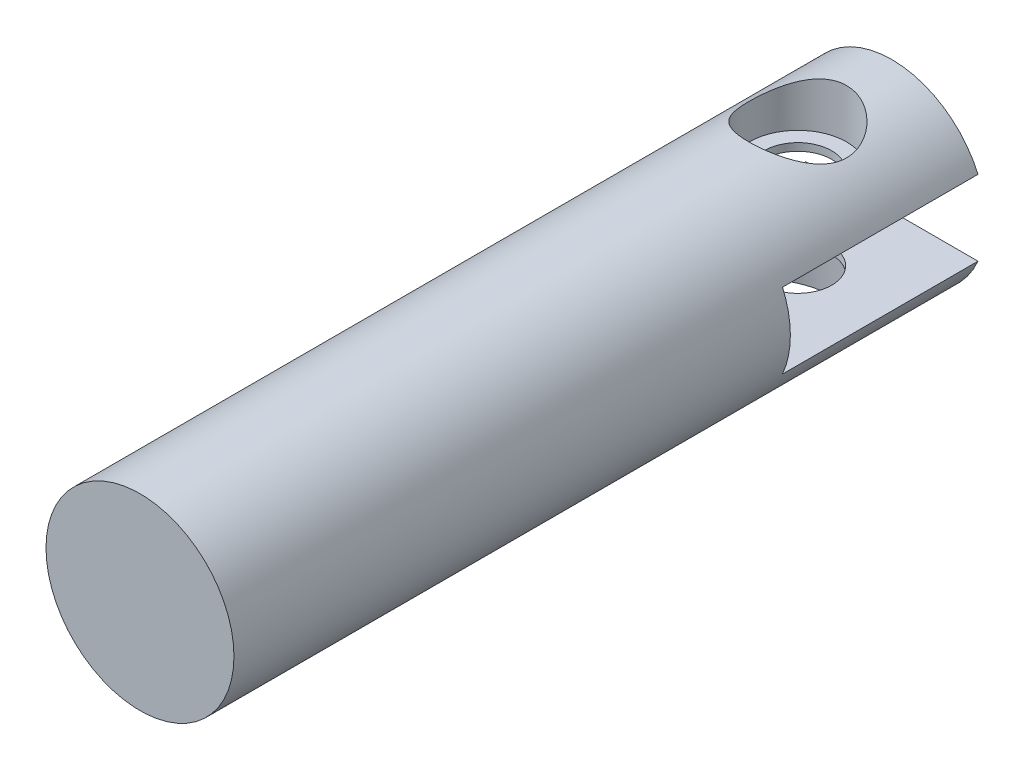
ISO-10303-21;
HEADER;
FILE_DESCRIPTION(('STEP AP214'),'2;1');
FILE_NAME('part.step','',(''),(''),'','','');
FILE_SCHEMA(('AUTOMOTIVE_DESIGN { 1 0 10303 214 1 1 1 1 }'));
ENDSEC;
DATA;
#1=APPLICATION_CONTEXT('core data for automotive mechanical design processes');
#2=APPLICATION_PROTOCOL_DEFINITION('international standard','automotive_design',2000,#1);
#3=PRODUCT_CONTEXT('',#1,'mechanical');
#4=PRODUCT('Part','Part','',(#3));
#5=PRODUCT_RELATED_PRODUCT_CATEGORY('part','',(#4));
#6=PRODUCT_DEFINITION_FORMATION('','',#4);
#7=PRODUCT_DEFINITION_CONTEXT('part definition',#1,'design');
#8=PRODUCT_DEFINITION('design','',#6,#7);
#9=PRODUCT_DEFINITION_SHAPE('','',#8);
#10=(LENGTH_UNIT() NAMED_UNIT(*) SI_UNIT(.MILLI.,.METRE.));
#11=(NAMED_UNIT(*) PLANE_ANGLE_UNIT() SI_UNIT($,.RADIAN.));
#12=(NAMED_UNIT(*) SI_UNIT($,.STERADIAN.) SOLID_ANGLE_UNIT());
#13=UNCERTAINTY_MEASURE_WITH_UNIT(LENGTH_MEASURE(1.E-05),#10,'distance_accuracy_value','');
#14=(GEOMETRIC_REPRESENTATION_CONTEXT(3) GLOBAL_UNCERTAINTY_ASSIGNED_CONTEXT((#13)) GLOBAL_UNIT_ASSIGNED_CONTEXT((#10,
#11,#12)) REPRESENTATION_CONTEXT('',''));
#15=CARTESIAN_POINT('',(0.,0.,0.));
#16=DIRECTION('',(0.,0.,1.));
#17=DIRECTION('',(1.,0.,0.));
#18=AXIS2_PLACEMENT_3D('',#15,#16,#17);
#19=CARTESIAN_POINT('',(0.,34.,-87.5));
#20=DIRECTION('',(0.,-1.,0.));
#21=DIRECTION('',(0.,0.,-1.));
#22=AXIS2_PLACEMENT_3D('',#19,#20,#21);
#23=CYLINDRICAL_SURFACE('',#22,4.50000000000001);
#24=CARTESIAN_POINT('',(0.,-5.,-87.5));
#25=DIRECTION('',(0.,-1.,0.));
#26=DIRECTION('',(1.,0.,0.));
#27=AXIS2_PLACEMENT_3D('',#24,#25,#26);
#28=CIRCLE('',#27,4.50000000000001);
#29=CARTESIAN_POINT('',(4.50000000000001,-5.,-87.5));
#30=VERTEX_POINT('',#29);
#31=EDGE_CURVE('E119',#30,#30,#28,.F.);
#32=ORIENTED_EDGE('',*,*,#31,.T.);
#33=EDGE_LOOP('',(#32));
#34=FACE_BOUND('',#33,.T.);
#35=CARTESIAN_POINT('',(0.,-6.,-87.5));
#36=DIRECTION('',(0.,-1.,0.));
#37=DIRECTION('',(0.,0.,-1.));
#38=AXIS2_PLACEMENT_3D('',#35,#36,#37);
#39=CIRCLE('',#38,4.50000000000001);
#40=CARTESIAN_POINT('',(0.,-6.,-92.));
#41=VERTEX_POINT('',#40);
#42=EDGE_CURVE('E148',#41,#41,#39,.T.);
#43=ORIENTED_EDGE('',*,*,#42,.T.);
#44=EDGE_LOOP('',(#43));
#45=FACE_BOUND('',#44,.T.);
#46=ADVANCED_FACE('F38',(#34,#45),#23,.F.);
#47=CARTESIAN_POINT('',(0.,0.,-100.));
#48=DIRECTION('',(0.,0.,1.));
#49=DIRECTION('',(1.,0.,0.));
#50=AXIS2_PLACEMENT_3D('',#47,#48,#49);
#51=CYLINDRICAL_SURFACE('',#50,12.5);
#52=CARTESIAN_POINT('',(0.,-12.5,-81.));
#53=CARTESIAN_POINT('',(-0.170102179768701,-12.5000000817607,-80.9999998749985));
#54=CARTESIAN_POINT('',(-0.340203730522906,-12.4965202030114,-81.0066844055968));
#55=CARTESIAN_POINT('',(-0.679143260443456,-12.4826897868394,-81.0333413769632));
#56=CARTESIAN_POINT('',(-0.847980733168351,-12.4723366305813,-81.0533188825871));
#57=CARTESIAN_POINT('',(-1.18325669039623,-12.4450082249668,-81.1063511142304));
#58=CARTESIAN_POINT('',(-1.34969192467295,-12.4280247429792,-81.1394220986647));
#59=CARTESIAN_POINT('',(-1.67882466641763,-12.3878590266554,-81.2182645344575));
#60=CARTESIAN_POINT('',(-1.84152061704865,-12.3646742594471,-81.2640411756425));
#61=CARTESIAN_POINT('',(-2.16133371678499,-12.3127882877834,-81.3675653236115));
#62=CARTESIAN_POINT('',(-2.31847244624079,-12.2841120580004,-81.4252587240431));
#63=CARTESIAN_POINT('',(-2.62703837319103,-12.2218448253505,-81.5521823654324));
#64=CARTESIAN_POINT('',(-2.77846340114046,-12.1882519787565,-81.6214169356782));
#65=CARTESIAN_POINT('',(-3.2227647415951,-12.0812389399572,-81.8454741714583));
#66=CARTESIAN_POINT('',(-3.50600225969856,-12.00152750654,-82.0167600206164));
#67=CARTESIAN_POINT('',(-4.05841803638287,-11.8266046343714,-82.4106339644455));
#68=CARTESIAN_POINT('',(-4.32554222954013,-11.7307283125818,-82.6358003851026));
#69=CARTESIAN_POINT('',(-4.69628203779343,-11.5850195094033,-83.0027499110349));
#70=CARTESIAN_POINT('',(-4.81494808018621,-11.5360970483101,-83.130038765752));
#71=CARTESIAN_POINT('',(-5.04183136084123,-11.4387565756884,-83.3938831880291));
#72=CARTESIAN_POINT('',(-5.15004686906865,-11.3903386488626,-83.5304402835512));
#73=CARTESIAN_POINT('',(-5.36425055486214,-11.2911437948522,-83.8243144486387));
#74=CARTESIAN_POINT('',(-5.46924802745793,-11.2405217468813,-83.9824070573169));
#75=CARTESIAN_POINT('',(-5.66541015653397,-11.142940611018,-84.3079441339447));
#76=CARTESIAN_POINT('',(-5.75658059663772,-11.0959799956239,-84.4753846514964));
#77=CARTESIAN_POINT('',(-5.92431489573907,-11.0073383184935,-84.8187691801487));
#78=CARTESIAN_POINT('',(-6.00087991151244,-10.9656568387282,-84.9947125164263));
#79=CARTESIAN_POINT('',(-6.13850710366562,-10.8892117927366,-85.3539131787853));
#80=CARTESIAN_POINT('',(-6.19957877396701,-10.8544439928234,-85.5371659457713));
#81=CARTESIAN_POINT('',(-6.30218146205836,-10.7951750460933,-85.8982678816672));
#82=CARTESIAN_POINT('',(-6.34468098813092,-10.7701751230011,-86.0757594650203));
#83=CARTESIAN_POINT('',(-6.41470644314232,-10.7286162937968,-86.4346557544139));
#84=CARTESIAN_POINT('',(-6.44223306365269,-10.7120569978295,-86.6160602793203));
#85=CARTESIAN_POINT('',(-6.48184102613849,-10.6881371348102,-86.9809753752545));
#86=CARTESIAN_POINT('',(-6.49393748407711,-10.6807675653182,-87.1644837071723));
#87=CARTESIAN_POINT('',(-6.50251867316758,-10.6755459597848,-87.531991409318));
#88=CARTESIAN_POINT('',(-6.49900512292153,-10.6776928760147,-87.7159907232615));
#89=CARTESIAN_POINT('',(-6.4779336447364,-10.690485992977,-88.0583780230013));
#90=CARTESIAN_POINT('',(-6.46229610323661,-10.6999696658012,-88.2169325352841));
#91=CARTESIAN_POINT('',(-6.41952469115379,-10.7256853541504,-88.5319794189516));
#92=CARTESIAN_POINT('',(-6.39238707410643,-10.7419195688168,-88.6884711011668));
#93=CARTESIAN_POINT('',(-6.32693918706094,-10.7805974648071,-88.9983000954527));
#94=CARTESIAN_POINT('',(-6.28862992562984,-10.8030405855867,-89.1516376909345));
#95=CARTESIAN_POINT('',(-6.20125136767929,-10.8534333951195,-89.4543109090073));
#96=CARTESIAN_POINT('',(-6.1521778192355,-10.8813852593979,-89.6036449239402));
#97=CARTESIAN_POINT('',(-5.98702750442126,-10.9736818484567,-90.0510636162896));
#98=CARTESIAN_POINT('',(-5.85448115729612,-11.0455582281071,-90.3417036003844));
#99=CARTESIAN_POINT('',(-5.5502209649817,-11.2015262872503,-90.8979093453023));
#100=CARTESIAN_POINT('',(-5.37848957046899,-11.2856234337604,-91.1634637957989));
#101=CARTESIAN_POINT('',(-4.97302123342375,-11.4706296372426,-91.7008939321571));
#102=CARTESIAN_POINT('',(-4.73398871296837,-11.5722530682082,-91.9685418224631));
#103=CARTESIAN_POINT('',(-4.21402945342024,-11.7715463372189,-92.4618860982527));
#104=CARTESIAN_POINT('',(-3.93307962490814,-11.8692139583368,-92.6875592077643));
#105=CARTESIAN_POINT('',(-3.47642623716485,-12.0079877527289,-92.9955173051091));
#106=CARTESIAN_POINT('',(-3.3136918543578,-12.0540200480384,-93.0951814803472));
#107=CARTESIAN_POINT('',(-2.97907272141415,-12.1410437884134,-93.2802795667285));
#108=CARTESIAN_POINT('',(-2.80719216227121,-12.1820375142491,-93.3657199227123));
#109=CARTESIAN_POINT('',(-2.45546048056832,-12.2577760531716,-93.5214364730986));
#110=CARTESIAN_POINT('',(-2.27561282133809,-12.2925235489308,-93.591719180112));
#111=CARTESIAN_POINT('',(-1.90923727141341,-12.3547284217657,-93.7162875515055));
#112=CARTESIAN_POINT('',(-1.72271022340797,-12.3821867148143,-93.7705752259413));
#113=CARTESIAN_POINT('',(-1.36106232283591,-12.4268967090447,-93.8583848672404));
#114=CARTESIAN_POINT('',(-1.18636404964187,-12.4448293485347,-93.8933042083783));
#115=CARTESIAN_POINT('',(-0.834103701990863,-12.4733910948644,-93.9487248394593));
#116=CARTESIAN_POINT('',(-0.656541791066254,-12.4840206172587,-93.9692269497588));
#117=CARTESIAN_POINT('',(-0.300120755768859,-12.4976686127682,-93.9955251411416));
#118=CARTESIAN_POINT('',(-0.12126224967808,-12.5006905012922,-94.0013278214669));
#119=CARTESIAN_POINT('',(0.236284139945546,-12.4990448966155,-93.9981633210838));
#120=CARTESIAN_POINT('',(0.414972031813424,-12.494377800539,-93.9891969031768));
#121=CARTESIAN_POINT('',(0.755401744913945,-12.478216275849,-93.9580212279511));
#122=CARTESIAN_POINT('',(0.917284703988002,-12.4673405399998,-93.9370114043632));
#123=CARTESIAN_POINT('',(1.23856187034401,-12.4395325184482,-93.8829856919681));
#124=CARTESIAN_POINT('',(1.39795521984855,-12.4225981913329,-93.8499657563495));
#125=CARTESIAN_POINT('',(1.71310086623498,-12.383073136756,-93.7722895901952));
#126=CARTESIAN_POINT('',(1.86885432944273,-12.3604842491242,-93.7276371443487));
#127=CARTESIAN_POINT('',(2.17589983429062,-12.3101453286452,-93.6271175582854));
#128=CARTESIAN_POINT('',(2.32719011152332,-12.2823932855308,-93.5712460492683));
#129=CARTESIAN_POINT('',(2.62833012418276,-12.2215417976825,-93.4471913144022));
#130=CARTESIAN_POINT('',(2.77803843778772,-12.1883213726783,-93.3787240464444));
#131=CARTESIAN_POINT('',(3.07110068406454,-12.1178007276817,-93.2310809281669));
#132=CARTESIAN_POINT('',(3.21445244538124,-12.0804991284469,-93.1519014554807));
#133=CARTESIAN_POINT('',(3.63393019244369,-11.963638078694,-92.8991713812886));
#134=CARTESIAN_POINT('',(3.89963990927491,-11.8790884965908,-92.7103621067167));
#135=CARTESIAN_POINT('',(4.42470256545219,-11.6943306551932,-92.2749504695324));
#136=CARTESIAN_POINT('',(4.68051907637963,-11.5934084258104,-92.0243793640752));
#137=CARTESIAN_POINT('',(5.0310599467724,-11.4435437338291,-91.6195145733392));
#138=CARTESIAN_POINT('',(5.14244980724584,-11.393803922674,-91.479605045448));
#139=CARTESIAN_POINT('',(5.35363561747331,-11.296109932411,-91.1906094724651));
#140=CARTESIAN_POINT('',(5.45342970514452,-11.2481560409293,-91.0415219594099));
#141=CARTESIAN_POINT('',(5.64633737641042,-11.1526299099181,-90.7256995514679));
#142=CARTESIAN_POINT('',(5.73869388293056,-11.1052522132642,-90.5584424933261));
#143=CARTESIAN_POINT('',(5.90874873074896,-11.0157125162419,-90.2153847103469));
#144=CARTESIAN_POINT('',(5.98645415038909,-10.97354800065,-90.0395881630666));
#145=CARTESIAN_POINT('',(6.12633225076864,-10.8960748948163,-89.6806242934491));
#146=CARTESIAN_POINT('',(6.18851839683361,-10.8607603671391,-89.4974635220602));
#147=CARTESIAN_POINT('',(6.29657941281774,-10.7984716757682,-89.1250125219969));
#148=CARTESIAN_POINT('',(6.34245704523098,-10.7714960996432,-88.935723337345));
#149=CARTESIAN_POINT('',(6.41350533088375,-10.729328128989,-88.5714236539538));
#150=CARTESIAN_POINT('',(6.44026120731625,-10.7132419703613,-88.3968250766316));
#151=CARTESIAN_POINT('',(6.47948428748327,-10.6895657042199,-88.0454565709335));
#152=CARTESIAN_POINT('',(6.49195250008269,-10.6819749968355,-87.8686867967586));
#153=CARTESIAN_POINT('',(6.50239455729016,-10.6756218846559,-87.5146466854908));
#154=CARTESIAN_POINT('',(6.50037540604591,-10.6768552137383,-87.3373766316991));
#155=CARTESIAN_POINT('',(6.48189359371957,-10.6880854985116,-86.9838806940718));
#156=CARTESIAN_POINT('',(6.46543172360703,-10.6980819742802,-86.8076547535863));
#157=CARTESIAN_POINT('',(6.42094645078702,-10.7248326058721,-86.477224085718));
#158=CARTESIAN_POINT('',(6.39440880139163,-10.7407137306852,-86.3227458301126));
#159=CARTESIAN_POINT('',(6.33044723149278,-10.7785343728271,-86.0167957580041));
#160=CARTESIAN_POINT('',(6.29301974317351,-10.8004758755854,-85.865324944225));
#161=CARTESIAN_POINT('',(6.1649688036172,-10.8744187303394,-85.4168097423224));
#162=CARTESIAN_POINT('',(6.05854902756634,-10.9345562065325,-85.1254600420524));
#163=CARTESIAN_POINT('',(5.79895130924553,-11.0745272310705,-84.5453636108173));
#164=CARTESIAN_POINT('',(5.64314924431518,-11.1553993537357,-84.2580598651944));
#165=CARTESIAN_POINT('',(5.29194721711999,-11.3262301565447,-83.7117434446302));
#166=CARTESIAN_POINT('',(5.09652602417684,-11.4161936954818,-83.4527460532106));
#167=CARTESIAN_POINT('',(4.64055784810852,-11.6096638480412,-82.9338305127456));
#168=CARTESIAN_POINT('',(4.37477828938145,-11.7133573184582,-82.6785203046866));
#169=CARTESIAN_POINT('',(3.94533251214793,-11.8620184001502,-82.3310152254548));
#170=CARTESIAN_POINT('',(3.79691348612777,-11.9104642980215,-82.221010874462));
#171=CARTESIAN_POINT('',(3.49050229724844,-12.0038320798739,-82.0136014762342));
#172=CARTESIAN_POINT('',(3.33251447004912,-12.0487555390239,-81.9161907845589));
#173=CARTESIAN_POINT('',(3.00497948045776,-12.1346308915057,-81.7332065362187));
#174=CARTESIAN_POINT('',(2.83527908021749,-12.1755001353339,-81.6478682815867));
#175=CARTESIAN_POINT('',(2.48799582357021,-12.2511808573756,-81.491999159388));
#176=CARTESIAN_POINT('',(2.31041690125512,-12.2859953172142,-81.421461000092));
#177=CARTESIAN_POINT('',(1.94898617403038,-12.348482261991,-81.2961334697328));
#178=CARTESIAN_POINT('',(1.76514835599826,-12.3761696221414,-81.2413112697045));
#179=CARTESIAN_POINT('',(1.39246519292947,-12.423618213801,-81.1479997442765));
#180=CARTESIAN_POINT('',(1.20362280833545,-12.443384024432,-81.1095009822209));
#181=CARTESIAN_POINT('',(0.845994989775567,-12.4724666077768,-81.0530684064383));
#182=CARTESIAN_POINT('',(0.677593715419103,-12.48276833808,-81.033190008548));
#183=CARTESIAN_POINT('',(0.339461438744472,-12.4965350712329,-81.0066557171623));
#184=CARTESIAN_POINT('',(0.169730406238253,-12.499999918418,-81.0000001247284));
#185=CARTESIAN_POINT('',(0.,-12.5,-81.));
#186=B_SPLINE_CURVE_WITH_KNOTS('',3,(#52,#53,#54,#55,#56,#57,#58,#59,#60,#61,#62,#63,#64,#65,
#66,#67,#68,#69,#70,#71,#72,#73,#74,#75,#76,#77,#78,#79,#80,#81,#82,#83,#84,#85,#86,#87,#88,#89,
#90,#91,#92,#93,#94,#95,#96,#97,#98,#99,#100,#101,#102,#103,#104,#105,#106,#107,#108,#109,#110,
#111,#112,#113,#114,#115,#116,#117,#118,#119,#120,#121,#122,#123,#124,#125,#126,#127,#128,#129,
#130,#131,#132,#133,#134,#135,#136,#137,#138,#139,#140,#141,#142,#143,#144,#145,#146,#147,#148,
#149,#150,#151,#152,#153,#154,#155,#156,#157,#158,#159,#160,#161,#162,#163,#164,#165,#166,#167,
#168,#169,#170,#171,#172,#173,#174,#175,#176,#177,#178,#179,#180,#181,#182,#183,#184,#185),
.UNSPECIFIED.,.T.,.F.,(4,2,2,2,2,2,2,2,2,2,2,2,2,2,2,2,2,2,2,2,2,2,2,2,2,2,2,2,2,2,2,2,2,2,2,2,
2,2,2,2,2,2,2,2,2,2,2,2,2,2,2,2,2,2,2,2,2,2,2,2,2,2,2,2,2,2,4),(0.,0.51013977814281,
1.0204740398471,1.53144399054481,2.04262296293378,2.5515301000013,3.06062856811167,
4.07776691305285,5.15988340568829,5.70174930893572,6.24370476221225,6.83223697742927,
7.42052233615542,8.00876108226526,8.59663849544532,9.14847147804329,9.70027897030532,
10.251545475153,10.8027512891743,11.281002515441,11.7594096650546,12.2377736378216,
12.7163269070978,13.6944189503461,14.6729499023897,15.787143460495,16.9019530342105,
17.4901943829273,18.0781684685923,18.6658894207309,19.2535364839178,19.789971956461,
20.3263769027632,20.8625409898003,21.3986773856482,21.8889151908901,22.3793183351907,
22.8695621234678,23.3599971884323,23.8632726412594,24.3667187056655,25.3730828706807,
26.4841318880604,27.0405209377517,27.5969992108937,28.1867762620416,28.7762676414813,
29.3652457553826,29.9541240548702,30.4854656027915,31.016769629892,31.5478168068796,
32.0788349023675,32.5509240714751,33.0231680846972,33.9670475214794,34.973270569225,
35.9800342531315,37.1228862182443,37.6952983495811,38.26745303148,38.8495573361043,
39.4313741719097,40.0119666476769,40.5922230210656,41.1012362538361,41.610261075859),.UNSPECIFIED.);
#187=CARTESIAN_POINT('',(0.,-12.5,-81.));
#188=VERTEX_POINT('',#187);
#189=EDGE_CURVE('E43',#188,#188,#186,.T.);
#190=ORIENTED_EDGE('',*,*,#189,.F.);
#191=EDGE_LOOP('',(#190));
#192=FACE_BOUND('',#191,.T.);
#193=CARTESIAN_POINT('',(0.,0.,0.));
#194=DIRECTION('',(0.,0.,1.));
#195=DIRECTION('',(1.,0.,0.));
#196=AXIS2_PLACEMENT_3D('',#193,#194,#195);
#197=CIRCLE('',#196,12.5);
#198=CARTESIAN_POINT('',(12.5,0.,0.));
#199=VERTEX_POINT('',#198);
#200=EDGE_CURVE('E124',#199,#199,#197,.T.);
#201=ORIENTED_EDGE('',*,*,#200,.F.);
#202=EDGE_LOOP('',(#201));
#203=FACE_BOUND('',#202,.T.);
#204=DIRECTION('',(0.,0.,-1.));
#205=VECTOR('',#204,1.);
#206=CARTESIAN_POINT('',(11.4564392373896,-5.,-74.));
#207=LINE('',#206,#205);
#208=CARTESIAN_POINT('',(11.4564392373896,-5.,-74.));
#209=VERTEX_POINT('',#208);
#210=CARTESIAN_POINT('',(11.4564392373896,-5.,-100.));
#211=VERTEX_POINT('',#210);
#212=EDGE_CURVE('E98',#209,#211,#207,.T.);
#213=ORIENTED_EDGE('',*,*,#212,.F.);
#214=CARTESIAN_POINT('',(0.,0.,-74.));
#215=DIRECTION('',(0.,0.,-1.));
#216=DIRECTION('',(-1.,0.,0.));
#217=AXIS2_PLACEMENT_3D('',#214,#215,#216);
#218=CIRCLE('',#217,12.5);
#219=CARTESIAN_POINT('',(11.4564392373896,5.,-74.));
#220=VERTEX_POINT('',#219);
#221=EDGE_CURVE('E102',#220,#209,#218,.T.);
#222=ORIENTED_EDGE('',*,*,#221,.F.);
#223=DIRECTION('',(0.,0.,-1.));
#224=VECTOR('',#223,1.);
#225=CARTESIAN_POINT('',(11.4564392373896,5.,-74.));
#226=LINE('',#225,#224);
#227=CARTESIAN_POINT('',(11.4564392373896,5.,-100.));
#228=VERTEX_POINT('',#227);
#229=EDGE_CURVE('E91',#220,#228,#226,.T.);
#230=ORIENTED_EDGE('',*,*,#229,.T.);
#231=CARTESIAN_POINT('',(0.,0.,-100.));
#232=DIRECTION('',(0.,0.,1.));
#233=DIRECTION('',(1.,0.,0.));
#234=AXIS2_PLACEMENT_3D('',#231,#232,#233);
#235=CIRCLE('',#234,12.5);
#236=CARTESIAN_POINT('',(-11.4564392373896,5.,-100.));
#237=VERTEX_POINT('',#236);
#238=EDGE_CURVE('E11',#228,#237,#235,.T.);
#239=ORIENTED_EDGE('',*,*,#238,.T.);
#240=DIRECTION('',(0.,0.,-1.));
#241=VECTOR('',#240,1.);
#242=CARTESIAN_POINT('',(-11.4564392373896,5.,-74.));
#243=LINE('',#242,#241);
#244=CARTESIAN_POINT('',(-11.4564392373896,5.,-74.));
#245=VERTEX_POINT('',#244);
#246=EDGE_CURVE('E61',#245,#237,#243,.T.);
#247=ORIENTED_EDGE('',*,*,#246,.F.);
#248=CARTESIAN_POINT('',(0.,0.,-74.));
#249=DIRECTION('',(0.,0.,-1.));
#250=DIRECTION('',(-1.,0.,0.));
#251=AXIS2_PLACEMENT_3D('',#248,#249,#250);
#252=CIRCLE('',#251,12.5);
#253=CARTESIAN_POINT('',(-11.4564392373896,-5.,-74.));
#254=VERTEX_POINT('',#253);
#255=EDGE_CURVE('E104',#254,#245,#252,.T.);
#256=ORIENTED_EDGE('',*,*,#255,.F.);
#257=DIRECTION('',(0.,0.,-1.));
#258=VECTOR('',#257,1.);
#259=CARTESIAN_POINT('',(-11.4564392373896,-5.,-74.));
#260=LINE('',#259,#258);
#261=CARTESIAN_POINT('',(-11.4564392373896,-5.,-100.));
#262=VERTEX_POINT('',#261);
#263=EDGE_CURVE('E70',#254,#262,#260,.T.);
#264=ORIENTED_EDGE('',*,*,#263,.T.);
#265=EDGE_CURVE('E53',#262,#211,#235,.T.);
#266=ORIENTED_EDGE('',*,*,#265,.T.);
#267=EDGE_LOOP('',(#213,#222,#230,#239,#247,#256,#264,#266));
#268=FACE_BOUND('',#267,.T.);
#269=CARTESIAN_POINT('',(0.,12.5,-94.));
#270=CARTESIAN_POINT('',(0.170102179768705,12.5000000817607,-94.0000001250016));
#271=CARTESIAN_POINT('',(0.340203730522911,12.4965202030114,-93.9933155944032));
#272=CARTESIAN_POINT('',(0.679143260443461,12.4826897868394,-93.9666586230368));
#273=CARTESIAN_POINT('',(0.847980733168356,12.4723366305813,-93.9466811174129));
#274=CARTESIAN_POINT('',(1.18325669039623,12.4450082249668,-93.8936488857696));
#275=CARTESIAN_POINT('',(1.34969192467296,12.4280247429792,-93.8605779013353));
#276=CARTESIAN_POINT('',(1.67882466641763,12.3878590266554,-93.7817354655425));
#277=CARTESIAN_POINT('',(1.84152061704865,12.3646742594471,-93.7359588243576));
#278=CARTESIAN_POINT('',(2.161333716785,12.3127882877834,-93.6324346763885));
#279=CARTESIAN_POINT('',(2.31847244624079,12.2841120580004,-93.5747412759569));
#280=CARTESIAN_POINT('',(2.62703837319103,12.2218448253505,-93.4478176345676));
#281=CARTESIAN_POINT('',(2.77846340114046,12.1882519787565,-93.3785830643218));
#282=CARTESIAN_POINT('',(3.2227647415951,12.0812389399572,-93.1545258285418));
#283=CARTESIAN_POINT('',(3.50600225969857,12.00152750654,-92.9832399793836));
#284=CARTESIAN_POINT('',(4.05841803638288,11.8266046343714,-92.5893660355545));
#285=CARTESIAN_POINT('',(4.32554222954013,11.7307283125818,-92.3641996148974));
#286=CARTESIAN_POINT('',(4.69628203779344,11.5850195094032,-91.9972500889651));
#287=CARTESIAN_POINT('',(4.81494808018622,11.5360970483101,-91.869961234248));
#288=CARTESIAN_POINT('',(5.04183136084124,11.4387565756884,-91.6061168119709));
#289=CARTESIAN_POINT('',(5.15004686906865,11.3903386488626,-91.4695597164488));
#290=CARTESIAN_POINT('',(5.36425055486215,11.2911437948522,-91.1756855513613));
#291=CARTESIAN_POINT('',(5.46924802745793,11.2405217468813,-91.0175929426831));
#292=CARTESIAN_POINT('',(5.66541015653398,11.142940611018,-90.6920558660553));
#293=CARTESIAN_POINT('',(5.75658059663772,11.0959799956239,-90.5246153485037));
#294=CARTESIAN_POINT('',(5.92431489573908,11.0073383184935,-90.1812308198513));
#295=CARTESIAN_POINT('',(6.00087991151245,10.9656568387282,-90.0052874835737));
#296=CARTESIAN_POINT('',(6.13850710366563,10.8892117927366,-89.6460868212147));
#297=CARTESIAN_POINT('',(6.19957877396702,10.8544439928234,-89.4628340542287));
#298=CARTESIAN_POINT('',(6.30218146205836,10.7951750460933,-89.1017321183328));
#299=CARTESIAN_POINT('',(6.34468098813092,10.7701751230011,-88.9242405349797));
#300=CARTESIAN_POINT('',(6.41470644314232,10.7286162937968,-88.5653442455861));
#301=CARTESIAN_POINT('',(6.44223306365269,10.7120569978295,-88.3839397206797));
#302=CARTESIAN_POINT('',(6.48184102613849,10.6881371348102,-88.0190246247455));
#303=CARTESIAN_POINT('',(6.49393748407712,10.6807675653182,-87.8355162928277));
#304=CARTESIAN_POINT('',(6.50251867316759,10.6755459597848,-87.4680085906821));
#305=CARTESIAN_POINT('',(6.49900512292153,10.6776928760147,-87.2840092767386));
#306=CARTESIAN_POINT('',(6.47793364473641,10.6904859929769,-86.9416219769987));
#307=CARTESIAN_POINT('',(6.46229610323661,10.6999696658012,-86.7830674647159));
#308=CARTESIAN_POINT('',(6.4195246911538,10.7256853541504,-86.4680205810484));
#309=CARTESIAN_POINT('',(6.39238707410643,10.7419195688168,-86.3115288988332));
#310=CARTESIAN_POINT('',(6.32693918706095,10.7805974648071,-86.0016999045473));
#311=CARTESIAN_POINT('',(6.28862992562985,10.8030405855867,-85.8483623090655));
#312=CARTESIAN_POINT('',(6.20125136767929,10.8534333951195,-85.5456890909927));
#313=CARTESIAN_POINT('',(6.1521778192355,10.8813852593979,-85.3963550760598));
#314=CARTESIAN_POINT('',(5.98702750442127,10.9736818484567,-84.9489363837104));
#315=CARTESIAN_POINT('',(5.85448115729612,11.0455582281071,-84.6582963996156));
#316=CARTESIAN_POINT('',(5.5502209649817,11.2015262872503,-84.1020906546977));
#317=CARTESIAN_POINT('',(5.378489570469,11.2856234337604,-83.8365362042011));
#318=CARTESIAN_POINT('',(4.97302123342375,11.4706296372426,-83.299106067843));
#319=CARTESIAN_POINT('',(4.73398871296838,11.5722530682082,-83.0314581775369));
#320=CARTESIAN_POINT('',(4.21402945342024,11.7715463372189,-82.5381139017473));
#321=CARTESIAN_POINT('',(3.93307962490815,11.8692139583368,-82.3124407922357));
#322=CARTESIAN_POINT('',(3.47642623716486,12.0079877527289,-82.0044826948909));
#323=CARTESIAN_POINT('',(3.3136918543578,12.0540200480384,-81.9048185196528));
#324=CARTESIAN_POINT('',(2.97907272141415,12.1410437884134,-81.7197204332715));
#325=CARTESIAN_POINT('',(2.80719216227121,12.1820375142491,-81.6342800772877));
#326=CARTESIAN_POINT('',(2.45546048056832,12.2577760531716,-81.4785635269015));
#327=CARTESIAN_POINT('',(2.27561282133809,12.2925235489308,-81.408280819888));
#328=CARTESIAN_POINT('',(1.90923727141342,12.3547284217657,-81.2837124484945));
#329=CARTESIAN_POINT('',(1.72271022340798,12.3821867148143,-81.2294247740587));
#330=CARTESIAN_POINT('',(1.36106232283591,12.4268967090446,-81.1416151327596));
#331=CARTESIAN_POINT('',(1.18636404964187,12.4448293485347,-81.1066957916217));
#332=CARTESIAN_POINT('',(0.834103701990866,12.4733910948644,-81.0512751605407));
#333=CARTESIAN_POINT('',(0.656541791066257,12.4840206172587,-81.0307730502412));
#334=CARTESIAN_POINT('',(0.300120755768864,12.4976686127682,-81.0044748588584));
#335=CARTESIAN_POINT('',(0.121262249678086,12.5006905012922,-80.9986721785331));
#336=CARTESIAN_POINT('',(-0.23628413994554,12.4990448966155,-81.0018366789162));
#337=CARTESIAN_POINT('',(-0.414972031813419,12.494377800539,-81.0108030968233));
#338=CARTESIAN_POINT('',(-0.755401744913939,12.478216275849,-81.0419787720489));
#339=CARTESIAN_POINT('',(-0.917284703987996,12.4673405399998,-81.0629885956368));
#340=CARTESIAN_POINT('',(-1.238561870344,12.4395325184482,-81.1170143080319));
#341=CARTESIAN_POINT('',(-1.39795521984854,12.4225981913329,-81.1500342436505));
#342=CARTESIAN_POINT('',(-1.71310086623498,12.383073136756,-81.2277104098049));
#343=CARTESIAN_POINT('',(-1.86885432944273,12.3604842491242,-81.2723628556513));
#344=CARTESIAN_POINT('',(-2.17589983429061,12.3101453286452,-81.3728824417146));
#345=CARTESIAN_POINT('',(-2.32719011152332,12.2823932855308,-81.4287539507317));
#346=CARTESIAN_POINT('',(-2.62833012418276,12.2215417976825,-81.5528086855978));
#347=CARTESIAN_POINT('',(-2.77803843778771,12.1883213726783,-81.6212759535556));
#348=CARTESIAN_POINT('',(-3.07110068406453,12.1178007276817,-81.7689190718331));
#349=CARTESIAN_POINT('',(-3.21445244538123,12.0804991284469,-81.8480985445193));
#350=CARTESIAN_POINT('',(-3.63393019244368,11.963638078694,-82.1008286187114));
#351=CARTESIAN_POINT('',(-3.8996399092749,11.8790884965908,-82.2896378932833));
#352=CARTESIAN_POINT('',(-4.42470256545219,11.6943306551932,-82.7250495304676));
#353=CARTESIAN_POINT('',(-4.68051907637962,11.5934084258104,-82.9756206359249));
#354=CARTESIAN_POINT('',(-5.03105994677239,11.4435437338291,-83.3804854266608));
#355=CARTESIAN_POINT('',(-5.14244980724583,11.393803922674,-83.520394954552));
#356=CARTESIAN_POINT('',(-5.3536356174733,11.296109932411,-83.809390527535));
#357=CARTESIAN_POINT('',(-5.45342970514451,11.2481560409293,-83.9584780405901));
#358=CARTESIAN_POINT('',(-5.64633737641042,11.1526299099181,-84.2743004485322));
#359=CARTESIAN_POINT('',(-5.73869388293056,11.1052522132642,-84.4415575066739));
#360=CARTESIAN_POINT('',(-5.90874873074896,11.0157125162419,-84.7846152896532));
#361=CARTESIAN_POINT('',(-5.98645415038909,10.97354800065,-84.9604118369334));
#362=CARTESIAN_POINT('',(-6.12633225076864,10.8960748948163,-85.319375706551));
#363=CARTESIAN_POINT('',(-6.18851839683361,10.8607603671391,-85.5025364779399));
#364=CARTESIAN_POINT('',(-6.29657941281774,10.7984716757682,-85.8749874780032));
#365=CARTESIAN_POINT('',(-6.34245704523098,10.7714960996432,-86.064276662655));
#366=CARTESIAN_POINT('',(-6.41350533088374,10.729328128989,-86.4285763460462));
#367=CARTESIAN_POINT('',(-6.44026120731624,10.7132419703613,-86.6031749233684));
#368=CARTESIAN_POINT('',(-6.47948428748326,10.6895657042199,-86.9545434290666));
#369=CARTESIAN_POINT('',(-6.49195250008268,10.6819749968355,-87.1313132032414));
#370=CARTESIAN_POINT('',(-6.50239455729015,10.6756218846559,-87.4853533145093));
#371=CARTESIAN_POINT('',(-6.5003754060459,10.6768552137383,-87.6626233683009));
#372=CARTESIAN_POINT('',(-6.48189359371957,10.6880854985116,-88.0161193059282));
#373=CARTESIAN_POINT('',(-6.46543172360703,10.6980819742802,-88.1923452464137));
#374=CARTESIAN_POINT('',(-6.42094645078702,10.7248326058721,-88.522775914282));
#375=CARTESIAN_POINT('',(-6.39440880139162,10.7407137306852,-88.6772541698874));
#376=CARTESIAN_POINT('',(-6.33044723149278,10.7785343728271,-88.9832042419959));
#377=CARTESIAN_POINT('',(-6.29301974317352,10.8004758755855,-89.134675055775));
#378=CARTESIAN_POINT('',(-6.1649688036172,10.8744187303394,-89.5831902576776));
#379=CARTESIAN_POINT('',(-6.05854902756634,10.9345562065325,-89.8745399579477));
#380=CARTESIAN_POINT('',(-5.79895130924553,11.0745272310705,-90.4546363891827));
#381=CARTESIAN_POINT('',(-5.64314924431518,11.1553993537357,-90.7419401348056));
#382=CARTESIAN_POINT('',(-5.29194721711999,11.3262301565447,-91.2882565553698));
#383=CARTESIAN_POINT('',(-5.09652602417684,11.4161936954818,-91.5472539467894));
#384=CARTESIAN_POINT('',(-4.64055784810852,11.6096638480412,-92.0661694872544));
#385=CARTESIAN_POINT('',(-4.37477828938145,11.7133573184582,-92.3214796953134));
#386=CARTESIAN_POINT('',(-3.94533251214793,11.8620184001502,-92.6689847745452));
#387=CARTESIAN_POINT('',(-3.79691348612776,11.9104642980215,-92.7789891255381));
#388=CARTESIAN_POINT('',(-3.49050229724843,12.0038320798739,-92.9863985237658));
#389=CARTESIAN_POINT('',(-3.33251447004911,12.048755539024,-93.0838092154411));
#390=CARTESIAN_POINT('',(-3.00497948045776,12.1346308915057,-93.2667934637813));
#391=CARTESIAN_POINT('',(-2.83527908021749,12.1755001353339,-93.3521317184133));
#392=CARTESIAN_POINT('',(-2.4879958235702,12.2511808573756,-93.508000840612));
#393=CARTESIAN_POINT('',(-2.31041690125512,12.2859953172142,-93.578538999908));
#394=CARTESIAN_POINT('',(-1.94898617403038,12.348482261991,-93.7038665302672));
#395=CARTESIAN_POINT('',(-1.76514835599826,12.3761696221414,-93.7586887302955));
#396=CARTESIAN_POINT('',(-1.39246519292947,12.423618213801,-93.8520002557236));
#397=CARTESIAN_POINT('',(-1.20362280833545,12.443384024432,-93.8904990177791));
#398=CARTESIAN_POINT('',(-0.845994989775572,12.4724666077768,-93.9469315935617));
#399=CARTESIAN_POINT('',(-0.677593715419107,12.48276833808,-93.9668099914521));
#400=CARTESIAN_POINT('',(-0.339461438744474,12.4965350712329,-93.9933442828377));
#401=CARTESIAN_POINT('',(-0.169730406238252,12.499999918418,-93.9999998752717));
#402=CARTESIAN_POINT('',(0.,12.5,-94.));
#403=B_SPLINE_CURVE_WITH_KNOTS('',3,(#269,#270,#271,#272,#273,#274,#275,#276,#277,#278,#279,
#280,#281,#282,#283,#284,#285,#286,#287,#288,#289,#290,#291,#292,#293,#294,#295,#296,#297,#298,
#299,#300,#301,#302,#303,#304,#305,#306,#307,#308,#309,#310,#311,#312,#313,#314,#315,#316,#317,
#318,#319,#320,#321,#322,#323,#324,#325,#326,#327,#328,#329,#330,#331,#332,#333,#334,#335,#336,
#337,#338,#339,#340,#341,#342,#343,#344,#345,#346,#347,#348,#349,#350,#351,#352,#353,#354,#355,
#356,#357,#358,#359,#360,#361,#362,#363,#364,#365,#366,#367,#368,#369,#370,#371,#372,#373,#374,
#375,#376,#377,#378,#379,#380,#381,#382,#383,#384,#385,#386,#387,#388,#389,#390,#391,#392,#393,
#394,#395,#396,#397,#398,#399,#400,#401,#402),.UNSPECIFIED.,.T.,.F.,(4,2,2,2,2,2,2,2,2,2,2,2,2,
2,2,2,2,2,2,2,2,2,2,2,2,2,2,2,2,2,2,2,2,2,2,2,2,2,2,2,2,2,2,2,2,2,2,2,2,2,2,2,2,2,2,2,2,2,2,2,2,
2,2,2,2,2,4),(0.,0.510139778142812,1.0204740398471,1.53144399054482,2.04262296293378,
2.5515301000013,3.06062856811167,4.07776691305285,5.1598834056883,5.70174930893573,
6.24370476221225,6.83223697742927,7.42052233615542,8.00876108226526,8.59663849544532,
9.14847147804327,9.70027897030532,10.251545475153,10.8027512891743,11.281002515441,
11.7594096650546,12.2377736378216,12.7163269070978,13.6944189503461,14.6729499023897,
15.787143460495,16.9019530342105,17.4901943829274,18.0781684685923,18.6658894207309,
19.2535364839178,19.789971956461,20.3263769027632,20.8625409898003,21.3986773856482,
21.8889151908901,22.3793183351907,22.8695621234678,23.3599971884323,23.8632726412594,
24.3667187056655,25.3730828706807,26.4841318880603,27.0405209377517,27.5969992108937,
28.1867762620416,28.7762676414814,29.3652457553826,29.9541240548702,30.4854656027915,
31.016769629892,31.5478168068796,32.0788349023675,32.5509240714751,33.0231680846972,
33.9670475214794,34.973270569225,35.9800342531315,37.1228862182443,37.6952983495811,
38.26745303148,38.8495573361043,39.4313741719097,40.0119666476769,40.5922230210656,
41.1012362538361,41.610261075859),.UNSPECIFIED.);
#404=CARTESIAN_POINT('',(0.,12.5,-94.));
#405=VERTEX_POINT('',#404);
#406=EDGE_CURVE('E136',#405,#405,#403,.T.);
#407=ORIENTED_EDGE('',*,*,#406,.T.);
#408=EDGE_LOOP('',(#407));
#409=FACE_BOUND('',#408,.T.);
#410=ADVANCED_FACE('F40',(#192,#203,#268,#409),#51,.T.);
#411=CARTESIAN_POINT('',(0.,5.,-87.5));
#412=DIRECTION('',(0.,1.,0.));
#413=DIRECTION('',(0.,0.,1.));
#414=AXIS2_PLACEMENT_3D('',#411,#412,#413);
#415=CIRCLE('',#414,4.50000000000001);
#416=CARTESIAN_POINT('',(0.,5.,-83.));
#417=VERTEX_POINT('',#416);
#418=EDGE_CURVE('E132',#417,#417,#415,.F.);
#419=ORIENTED_EDGE('',*,*,#418,.T.);
#420=EDGE_LOOP('',(#419));
#421=FACE_BOUND('',#420,.T.);
#422=CARTESIAN_POINT('',(0.,5.99999999999999,-87.5));
#423=DIRECTION('',(0.,1.,0.));
#424=DIRECTION('',(0.,0.,1.));
#425=AXIS2_PLACEMENT_3D('',#422,#423,#424);
#426=CIRCLE('',#425,4.50000000000001);
#427=CARTESIAN_POINT('',(0.,5.99999999999999,-83.));
#428=VERTEX_POINT('',#427);
#429=EDGE_CURVE('E137',#428,#428,#426,.T.);
#430=ORIENTED_EDGE('',*,*,#429,.T.);
#431=EDGE_LOOP('',(#430));
#432=FACE_BOUND('',#431,.T.);
#433=ADVANCED_FACE('F159',(#421,#432),#23,.F.);
#434=CARTESIAN_POINT('',(0.,0.,-100.));
#435=DIRECTION('',(0.,0.,1.));
#436=DIRECTION('',(1.,0.,0.));
#437=AXIS2_PLACEMENT_3D('',#434,#435,#436);
#438=PLANE('',#437);
#439=ORIENTED_EDGE('',*,*,#265,.F.);
#440=DIRECTION('',(-1.,0.,0.));
#441=VECTOR('',#440,1.);
#442=CARTESIAN_POINT('',(-11.4564392373896,-5.,-100.));
#443=LINE('',#442,#441);
#444=EDGE_CURVE('E84',#211,#262,#443,.T.);
#445=ORIENTED_EDGE('',*,*,#444,.F.);
#446=EDGE_LOOP('',(#439,#445));
#447=FACE_BOUND('',#446,.T.);
#448=ADVANCED_FACE('F172',(#447),#438,.F.);
#449=ORIENTED_EDGE('',*,*,#238,.F.);
#450=DIRECTION('',(1.,0.,0.));
#451=VECTOR('',#450,1.);
#452=CARTESIAN_POINT('',(-11.4564392373896,5.,-100.));
#453=LINE('',#452,#451);
#454=EDGE_CURVE('E93',#237,#228,#453,.T.);
#455=ORIENTED_EDGE('',*,*,#454,.F.);
#456=EDGE_LOOP('',(#449,#455));
#457=FACE_BOUND('',#456,.T.);
#458=ADVANCED_FACE('F170',(#457),#438,.F.);
#459=CARTESIAN_POINT('',(0.,0.,0.));
#460=DIRECTION('',(0.,0.,1.));
#461=DIRECTION('',(1.,0.,0.));
#462=AXIS2_PLACEMENT_3D('',#459,#460,#461);
#463=PLANE('',#462);
#464=ORIENTED_EDGE('',*,*,#200,.T.);
#465=EDGE_LOOP('',(#464));
#466=FACE_BOUND('',#465,.T.);
#467=ADVANCED_FACE('F165',(#466),#463,.T.);
#468=CARTESIAN_POINT('',(-11.4564392373896,-5.,-74.));
#469=DIRECTION('',(0.,-1.,0.));
#470=DIRECTION('',(1.,0.,0.));
#471=AXIS2_PLACEMENT_3D('',#468,#469,#470);
#472=PLANE('',#471);
#473=ORIENTED_EDGE('',*,*,#31,.F.);
#474=EDGE_LOOP('',(#473));
#475=FACE_BOUND('',#474,.T.);
#476=ORIENTED_EDGE('',*,*,#444,.T.);
#477=ORIENTED_EDGE('',*,*,#263,.F.);
#478=DIRECTION('',(-1.,0.,0.));
#479=VECTOR('',#478,1.);
#480=CARTESIAN_POINT('',(-11.4564392373896,-5.,-74.));
#481=LINE('',#480,#479);
#482=EDGE_CURVE('E111',#209,#254,#481,.T.);
#483=ORIENTED_EDGE('',*,*,#482,.F.);
#484=ORIENTED_EDGE('',*,*,#212,.T.);
#485=EDGE_LOOP('',(#476,#477,#483,#484));
#486=FACE_BOUND('',#485,.T.);
#487=ADVANCED_FACE('F162',(#475,#486),#472,.F.);
#488=CARTESIAN_POINT('',(-11.4564392373896,5.,-74.));
#489=DIRECTION('',(0.,1.,0.));
#490=DIRECTION('',(0.,0.,1.));
#491=AXIS2_PLACEMENT_3D('',#488,#489,#490);
#492=PLANE('',#491);
#493=ORIENTED_EDGE('',*,*,#418,.F.);
#494=EDGE_LOOP('',(#493));
#495=FACE_BOUND('',#494,.T.);
#496=ORIENTED_EDGE('',*,*,#454,.T.);
#497=ORIENTED_EDGE('',*,*,#229,.F.);
#498=DIRECTION('',(1.,0.,0.));
#499=VECTOR('',#498,1.);
#500=CARTESIAN_POINT('',(-11.4564392373896,5.,-74.));
#501=LINE('',#500,#499);
#502=EDGE_CURVE('E88',#245,#220,#501,.T.);
#503=ORIENTED_EDGE('',*,*,#502,.F.);
#504=ORIENTED_EDGE('',*,*,#246,.T.);
#505=EDGE_LOOP('',(#496,#497,#503,#504));
#506=FACE_BOUND('',#505,.T.);
#507=ADVANCED_FACE('F92',(#495,#506),#492,.F.);
#508=CARTESIAN_POINT('',(0.,0.,-74.));
#509=DIRECTION('',(0.,0.,-1.));
#510=DIRECTION('',(-1.,0.,0.));
#511=AXIS2_PLACEMENT_3D('',#508,#509,#510);
#512=PLANE('',#511);
#513=ORIENTED_EDGE('',*,*,#255,.T.);
#514=ORIENTED_EDGE('',*,*,#502,.T.);
#515=ORIENTED_EDGE('',*,*,#221,.T.);
#516=ORIENTED_EDGE('',*,*,#482,.T.);
#517=EDGE_LOOP('',(#513,#514,#515,#516));
#518=FACE_BOUND('',#517,.T.);
#519=ADVANCED_FACE('F101',(#518),#512,.T.);
#520=CARTESIAN_POINT('',(0.,22.,-87.5));
#521=DIRECTION('',(0.,-1.,0.));
#522=DIRECTION('',(0.,0.,-1.));
#523=AXIS2_PLACEMENT_3D('',#520,#521,#522);
#524=CYLINDRICAL_SURFACE('',#523,6.5);
#525=ORIENTED_EDGE('',*,*,#406,.F.);
#526=EDGE_LOOP('',(#525));
#527=FACE_BOUND('',#526,.T.);
#528=CARTESIAN_POINT('',(0.,6.,-87.5));
#529=DIRECTION('',(0.,1.,0.));
#530=DIRECTION('',(0.,0.,1.));
#531=AXIS2_PLACEMENT_3D('',#528,#529,#530);
#532=CIRCLE('',#531,6.5);
#533=CARTESIAN_POINT('',(0.,6.,-81.));
#534=VERTEX_POINT('',#533);
#535=EDGE_CURVE('E141',#534,#534,#532,.T.);
#536=ORIENTED_EDGE('',*,*,#535,.F.);
#537=EDGE_LOOP('',(#536));
#538=FACE_BOUND('',#537,.T.);
#539=ADVANCED_FACE('F149',(#527,#538),#524,.F.);
#540=CARTESIAN_POINT('',(0.,6.,-87.5));
#541=DIRECTION('',(0.,1.,0.));
#542=DIRECTION('',(0.,0.,1.));
#543=AXIS2_PLACEMENT_3D('',#540,#541,#542);
#544=PLANE('',#543);
#545=ORIENTED_EDGE('',*,*,#429,.F.);
#546=EDGE_LOOP('',(#545));
#547=FACE_BOUND('',#546,.T.);
#548=ORIENTED_EDGE('',*,*,#535,.T.);
#549=EDGE_LOOP('',(#548));
#550=FACE_BOUND('',#549,.T.);
#551=ADVANCED_FACE('F154',(#547,#550),#544,.T.);
#552=CARTESIAN_POINT('',(0.,-22.,-87.5));
#553=DIRECTION('',(0.,1.,0.));
#554=DIRECTION('',(0.,0.,1.));
#555=AXIS2_PLACEMENT_3D('',#552,#553,#554);
#556=CYLINDRICAL_SURFACE('',#555,6.5);
#557=ORIENTED_EDGE('',*,*,#189,.T.);
#558=EDGE_LOOP('',(#557));
#559=FACE_BOUND('',#558,.T.);
#560=CARTESIAN_POINT('',(0.,-6.,-87.5));
#561=DIRECTION('',(0.,1.,0.));
#562=DIRECTION('',(0.,0.,1.));
#563=AXIS2_PLACEMENT_3D('',#560,#561,#562);
#564=CIRCLE('',#563,6.5);
#565=CARTESIAN_POINT('',(0.,-6.,-81.));
#566=VERTEX_POINT('',#565);
#567=EDGE_CURVE('E195',#566,#566,#564,.T.);
#568=ORIENTED_EDGE('',*,*,#567,.T.);
#569=EDGE_LOOP('',(#568));
#570=FACE_BOUND('',#569,.T.);
#571=ADVANCED_FACE('F208',(#559,#570),#556,.F.);
#572=CARTESIAN_POINT('',(0.,-6.,-87.5));
#573=DIRECTION('',(0.,-1.,0.));
#574=DIRECTION('',(0.,0.,1.));
#575=AXIS2_PLACEMENT_3D('',#572,#573,#574);
#576=PLANE('',#575);
#577=ORIENTED_EDGE('',*,*,#42,.F.);
#578=EDGE_LOOP('',(#577));
#579=FACE_BOUND('',#578,.T.);
#580=ORIENTED_EDGE('',*,*,#567,.F.);
#581=EDGE_LOOP('',(#580));
#582=FACE_BOUND('',#581,.T.);
#583=ADVANCED_FACE('F210',(#579,#582),#576,.T.);
#584=CLOSED_SHELL('',(#46,#410,#433,#448,#458,#467,#487,#507,#519,#539,#551,#571,#583));
#585=MANIFOLD_SOLID_BREP('B2',#584);
#586=ADVANCED_BREP_SHAPE_REPRESENTATION('',(#18,#585),#14);
#587=SHAPE_DEFINITION_REPRESENTATION(#9,#586);
ENDSEC;
END-ISO-10303-21;
